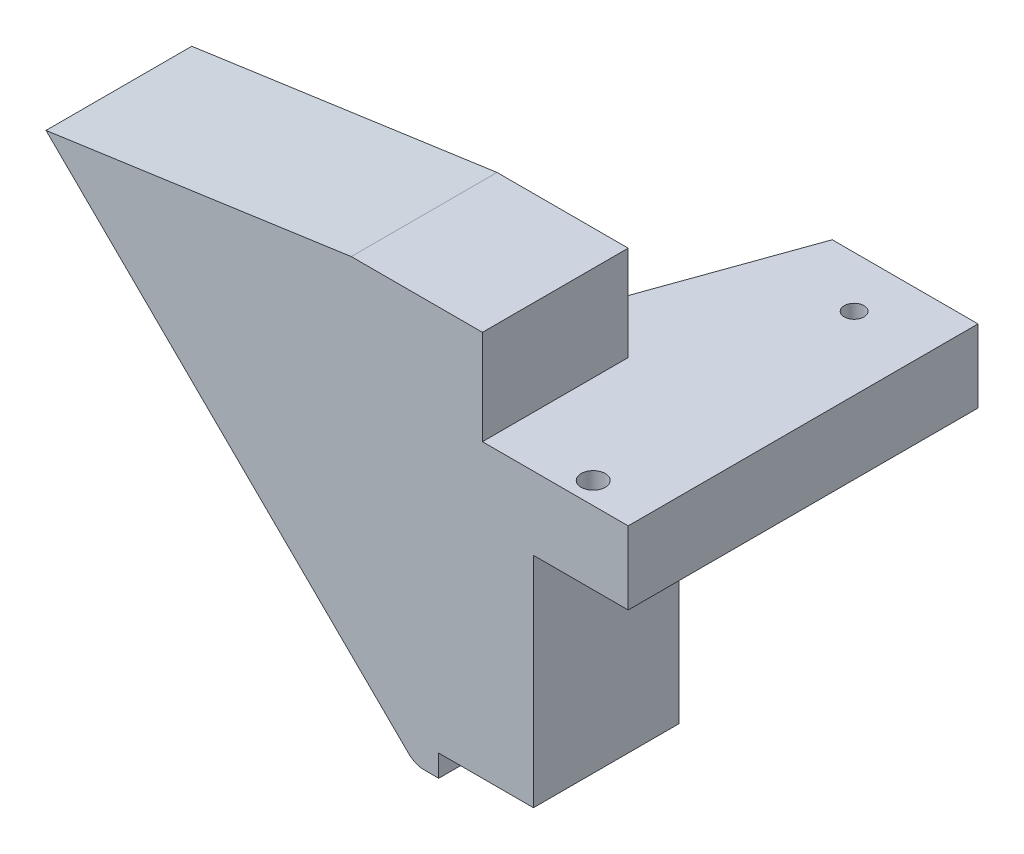
ISO-10303-21;
HEADER;
FILE_DESCRIPTION(('STEP AP214'),'2;1');
FILE_NAME('part.step','',(''),(''),'','','');
FILE_SCHEMA(('AUTOMOTIVE_DESIGN { 1 0 10303 214 1 1 1 1 }'));
ENDSEC;
DATA;
#1=APPLICATION_CONTEXT('core data for automotive mechanical design processes');
#2=APPLICATION_PROTOCOL_DEFINITION('international standard','automotive_design',2000,#1);
#3=PRODUCT_CONTEXT('',#1,'mechanical');
#4=PRODUCT('Part','Part','',(#3));
#5=PRODUCT_RELATED_PRODUCT_CATEGORY('part','',(#4));
#6=PRODUCT_DEFINITION_FORMATION('','',#4);
#7=PRODUCT_DEFINITION_CONTEXT('part definition',#1,'design');
#8=PRODUCT_DEFINITION('design','',#6,#7);
#9=PRODUCT_DEFINITION_SHAPE('','',#8);
#10=(LENGTH_UNIT() NAMED_UNIT(*) SI_UNIT(.MILLI.,.METRE.));
#11=(NAMED_UNIT(*) PLANE_ANGLE_UNIT() SI_UNIT($,.RADIAN.));
#12=(NAMED_UNIT(*) SI_UNIT($,.STERADIAN.) SOLID_ANGLE_UNIT());
#13=UNCERTAINTY_MEASURE_WITH_UNIT(LENGTH_MEASURE(1.E-05),#10,'distance_accuracy_value','');
#14=(GEOMETRIC_REPRESENTATION_CONTEXT(3) GLOBAL_UNCERTAINTY_ASSIGNED_CONTEXT((#13)) GLOBAL_UNIT_ASSIGNED_CONTEXT((#10,
#11,#12)) REPRESENTATION_CONTEXT('',''));
#15=CARTESIAN_POINT('',(0.,0.,0.));
#16=DIRECTION('',(0.,0.,1.));
#17=DIRECTION('',(1.,0.,0.));
#18=AXIS2_PLACEMENT_3D('',#15,#16,#17);
#19=CARTESIAN_POINT('',(-13.,0.,164.159554326699));
#20=DIRECTION('',(0.,0.,1.));
#21=DIRECTION('',(-1.,0.,0.));
#22=AXIS2_PLACEMENT_3D('',#19,#20,#21);
#23=PLANE('',#22);
#24=DIRECTION('',(1.,0.,0.));
#25=VECTOR('',#24,1.);
#26=CARTESIAN_POINT('',(-7.99999999999999,22.,164.159554326699));
#27=LINE('',#26,#25);
#28=CARTESIAN_POINT('',(-7.99999999999999,22.,164.159554326699));
#29=VERTEX_POINT('',#28);
#30=CARTESIAN_POINT('',(2.,22.,164.159554326699));
#31=VERTEX_POINT('',#30);
#32=EDGE_CURVE('E230',#29,#31,#27,.T.);
#33=ORIENTED_EDGE('',*,*,#32,.T.);
#34=DIRECTION('',(0.,-1.,0.));
#35=VECTOR('',#34,1.);
#36=CARTESIAN_POINT('',(2.,30.,164.159554326699));
#37=LINE('',#36,#35);
#38=CARTESIAN_POINT('',(2.,0.,164.159554326699));
#39=VERTEX_POINT('',#38);
#40=EDGE_CURVE('E285',#31,#39,#37,.T.);
#41=ORIENTED_EDGE('',*,*,#40,.T.);
#42=DIRECTION('',(-1.,0.,0.));
#43=VECTOR('',#42,1.);
#44=CARTESIAN_POINT('',(2.,0.,164.159554326699));
#45=LINE('',#44,#43);
#46=CARTESIAN_POINT('',(-11.,0.,164.159554326699));
#47=VERTEX_POINT('',#46);
#48=EDGE_CURVE('E288',#39,#47,#45,.T.);
#49=ORIENTED_EDGE('',*,*,#48,.T.);
#50=DIRECTION('',(0.,-1.,0.));
#51=VECTOR('',#50,1.);
#52=CARTESIAN_POINT('',(-11.,0.,164.159554326699));
#53=LINE('',#52,#51);
#54=CARTESIAN_POINT('',(-11.,-3.,164.159554326699));
#55=VERTEX_POINT('',#54);
#56=EDGE_CURVE('E291',#47,#55,#53,.T.);
#57=ORIENTED_EDGE('',*,*,#56,.T.);
#58=DIRECTION('',(-1.,0.,0.));
#59=VECTOR('',#58,1.);
#60=CARTESIAN_POINT('',(-11.,-3.,164.159554326699));
#61=LINE('',#60,#59);
#62=CARTESIAN_POINT('',(-13.,-3.,164.159554326699));
#63=VERTEX_POINT('',#62);
#64=EDGE_CURVE('E294',#55,#63,#61,.T.);
#65=ORIENTED_EDGE('',*,*,#64,.T.);
#66=CARTESIAN_POINT('',(-13.,0.,164.159554326699));
#67=DIRECTION('',(0.,0.,-1.));
#68=DIRECTION('',(-1.,0.,0.));
#69=AXIS2_PLACEMENT_3D('',#66,#67,#68);
#70=CIRCLE('',#69,3.);
#71=CARTESIAN_POINT('',(-15.1213203435597,-2.12132034355963,164.159554326699));
#72=VERTEX_POINT('',#71);
#73=EDGE_CURVE('E297',#63,#72,#70,.T.);
#74=ORIENTED_EDGE('',*,*,#73,.T.);
#75=DIRECTION('',(-0.711348006313715,0.702839963230252,0.));
#76=VECTOR('',#75,1.);
#77=CARTESIAN_POINT('',(-15.1213203435597,-2.12132034355963,164.159554326699));
#78=LINE('',#77,#76);
#79=CARTESIAN_POINT('',(-64.8885781508878,47.0506986076638,164.159554326699));
#80=VERTEX_POINT('',#79);
#81=EDGE_CURVE('E300',#72,#80,#78,.T.);
#82=ORIENTED_EDGE('',*,*,#81,.T.);
#83=DIRECTION('',(0.99006425657859,0.140615674252494,0.));
#84=VECTOR('',#83,1.);
#85=CARTESIAN_POINT('',(-64.8885781508878,47.0506986076638,164.159554326699));
#86=LINE('',#85,#84);
#87=CARTESIAN_POINT('',(-23.0000000000006,53.,164.159554326699));
#88=VERTEX_POINT('',#87);
#89=EDGE_CURVE('E303',#80,#88,#86,.T.);
#90=ORIENTED_EDGE('',*,*,#89,.T.);
#91=DIRECTION('',(1.,0.,0.));
#92=VECTOR('',#91,1.);
#93=CARTESIAN_POINT('',(-23.0000000000006,53.,164.159554326699));
#94=LINE('',#93,#92);
#95=CARTESIAN_POINT('',(-5.,53.,164.159554326699));
#96=VERTEX_POINT('',#95);
#97=EDGE_CURVE('E306',#88,#96,#94,.T.);
#98=ORIENTED_EDGE('',*,*,#97,.T.);
#99=DIRECTION('',(0.,-1.,0.));
#100=VECTOR('',#99,1.);
#101=CARTESIAN_POINT('',(-5.,53.,164.159554326699));
#102=LINE('',#101,#100);
#103=CARTESIAN_POINT('',(-5.,40.,164.159554326699));
#104=VERTEX_POINT('',#103);
#105=EDGE_CURVE('E220',#96,#104,#102,.T.);
#106=ORIENTED_EDGE('',*,*,#105,.T.);
#107=DIRECTION('',(-1.,0.,0.));
#108=VECTOR('',#107,1.);
#109=CARTESIAN_POINT('',(15.,40.,164.159554326699));
#110=LINE('',#109,#108);
#111=CARTESIAN_POINT('',(-15.,40.,164.159554326699));
#112=VERTEX_POINT('',#111);
#113=EDGE_CURVE('E200',#104,#112,#110,.T.);
#114=ORIENTED_EDGE('',*,*,#113,.T.);
#115=DIRECTION('',(0.,-1.,0.));
#116=VECTOR('',#115,1.);
#117=CARTESIAN_POINT('',(-15.,40.,164.159554326699));
#118=LINE('',#117,#116);
#119=CARTESIAN_POINT('',(-15.,43.,164.159554326699));
#120=VERTEX_POINT('',#119);
#121=EDGE_CURVE('E207',#120,#112,#118,.T.);
#122=ORIENTED_EDGE('',*,*,#121,.F.);
#123=DIRECTION('',(1.,0.,0.));
#124=VECTOR('',#123,1.);
#125=CARTESIAN_POINT('',(-5.,43.,164.159554326699));
#126=LINE('',#125,#124);
#127=CARTESIAN_POINT('',(-22.2934113871567,43.,164.159554326699));
#128=VERTEX_POINT('',#127);
#129=EDGE_CURVE('E265',#128,#120,#126,.T.);
#130=ORIENTED_EDGE('',*,*,#129,.F.);
#131=DIRECTION('',(0.99006425657859,0.140615674252493,0.));
#132=VECTOR('',#131,1.);
#133=CARTESIAN_POINT('',(-21.5938432574751,43.0993574342141,164.159554326699));
#134=LINE('',#133,#132);
#135=CARTESIAN_POINT('',(-43.5109209246919,39.9865446714646,164.159554326699));
#136=VERTEX_POINT('',#135);
#137=EDGE_CURVE('E268',#136,#128,#134,.T.);
#138=ORIENTED_EDGE('',*,*,#137,.F.);
#139=DIRECTION('',(-0.711348006313715,0.702839963230252,0.));
#140=VECTOR('',#139,1.);
#141=CARTESIAN_POINT('',(-8.09292071125713,4.99215971957752,164.159554326699));
#142=LINE('',#141,#140);
#143=CARTESIAN_POINT('',(-13.1613820762649,10.,164.159554326699));
#144=VERTEX_POINT('',#143);
#145=EDGE_CURVE('E271',#144,#136,#142,.T.);
#146=ORIENTED_EDGE('',*,*,#145,.F.);
#147=DIRECTION('',(-1.,0.,0.));
#148=VECTOR('',#147,1.);
#149=CARTESIAN_POINT('',(0.,10.,164.159554326699));
#150=LINE('',#149,#148);
#151=CARTESIAN_POINT('',(-8.,10.,164.159554326699));
#152=VERTEX_POINT('',#151);
#153=EDGE_CURVE('E274',#152,#144,#150,.T.);
#154=ORIENTED_EDGE('',*,*,#153,.F.);
#155=DIRECTION('',(0.,-1.,0.));
#156=VECTOR('',#155,1.);
#157=CARTESIAN_POINT('',(-8.,0.,164.159554326699));
#158=LINE('',#157,#156);
#159=EDGE_CURVE('E214',#29,#152,#158,.T.);
#160=ORIENTED_EDGE('',*,*,#159,.F.);
#161=EDGE_LOOP('',(#33,#41,#49,#57,#65,#74,#82,#90,#98,#106,#114,#122,#130,#138,#146,#154,#160));
#162=FACE_BOUND('',#161,.T.);
#163=ADVANCED_FACE('F33',(#162),#23,.F.);
#164=CARTESIAN_POINT('',(15.,0.,252.319108653397));
#165=DIRECTION('',(1.,0.,0.));
#166=DIRECTION('',(0.,0.,1.));
#167=AXIS2_PLACEMENT_3D('',#164,#165,#166);
#168=PLANE('',#167);
#169=DIRECTION('',(0.,0.,-1.));
#170=VECTOR('',#169,1.);
#171=CARTESIAN_POINT('',(15.,40.,231.319108653397));
#172=LINE('',#171,#170);
#173=CARTESIAN_POINT('',(15.,40.,184.159554326699));
#174=VERTEX_POINT('',#173);
#175=CARTESIAN_POINT('',(15.,40.,136.159554326699));
#176=VERTEX_POINT('',#175);
#177=EDGE_CURVE('E346',#174,#176,#172,.T.);
#178=ORIENTED_EDGE('',*,*,#177,.F.);
#179=DIRECTION('',(0.,1.,0.));
#180=VECTOR('',#179,1.);
#181=CARTESIAN_POINT('',(15.,0.,184.159554326699));
#182=LINE('',#181,#180);
#183=CARTESIAN_POINT('',(15.,30.,184.159554326699));
#184=VERTEX_POINT('',#183);
#185=EDGE_CURVE('E323',#184,#174,#182,.T.);
#186=ORIENTED_EDGE('',*,*,#185,.F.);
#187=DIRECTION('',(0.,0.,1.));
#188=VECTOR('',#187,1.);
#189=CARTESIAN_POINT('',(15.,30.,169.159554326699));
#190=LINE('',#189,#188);
#191=CARTESIAN_POINT('',(15.,30.,136.159554326699));
#192=VERTEX_POINT('',#191);
#193=EDGE_CURVE('E310',#192,#184,#190,.T.);
#194=ORIENTED_EDGE('',*,*,#193,.F.);
#195=DIRECTION('',(0.,1.,0.));
#196=VECTOR('',#195,1.);
#197=CARTESIAN_POINT('',(15.,30.,136.159554326699));
#198=LINE('',#197,#196);
#199=EDGE_CURVE('E232',#192,#176,#198,.T.);
#200=ORIENTED_EDGE('',*,*,#199,.T.);
#201=EDGE_LOOP('',(#178,#186,#194,#200));
#202=FACE_BOUND('',#201,.T.);
#203=ADVANCED_FACE('F399',(#202),#168,.T.);
#204=CARTESIAN_POINT('',(-11.,0.,80.3191086533971));
#205=DIRECTION('',(-1.,0.,0.));
#206=DIRECTION('',(0.,-1.,0.));
#207=AXIS2_PLACEMENT_3D('',#204,#205,#206);
#208=PLANE('',#207);
#209=DIRECTION('',(0.,-1.,0.));
#210=VECTOR('',#209,1.);
#211=CARTESIAN_POINT('',(-11.,0.,184.159554326699));
#212=LINE('',#211,#210);
#213=CARTESIAN_POINT('',(-11.,0.,184.159554326699));
#214=VERTEX_POINT('',#213);
#215=CARTESIAN_POINT('',(-11.,-3.,184.159554326699));
#216=VERTEX_POINT('',#215);
#217=EDGE_CURVE('E331',#214,#216,#212,.T.);
#218=ORIENTED_EDGE('',*,*,#217,.T.);
#219=DIRECTION('',(0.,0.,1.));
#220=VECTOR('',#219,1.);
#221=CARTESIAN_POINT('',(-11.,-3.,80.3191086533971));
#222=LINE('',#221,#220);
#223=EDGE_CURVE('E348',#55,#216,#222,.T.);
#224=ORIENTED_EDGE('',*,*,#223,.F.);
#225=ORIENTED_EDGE('',*,*,#56,.F.);
#226=DIRECTION('',(0.,0.,1.));
#227=VECTOR('',#226,1.);
#228=CARTESIAN_POINT('',(-11.,0.,80.3191086533971));
#229=LINE('',#228,#227);
#230=EDGE_CURVE('E349',#47,#214,#229,.T.);
#231=ORIENTED_EDGE('',*,*,#230,.T.);
#232=EDGE_LOOP('',(#218,#224,#225,#231));
#233=FACE_BOUND('',#232,.T.);
#234=ADVANCED_FACE('F449',(#233),#208,.F.);
#235=CARTESIAN_POINT('',(-5.,-3.,80.3191086533971));
#236=DIRECTION('',(0.,1.,0.));
#237=DIRECTION('',(-1.,0.,0.));
#238=AXIS2_PLACEMENT_3D('',#235,#236,#237);
#239=PLANE('',#238);
#240=DIRECTION('',(1.,0.,0.));
#241=VECTOR('',#240,1.);
#242=CARTESIAN_POINT('',(-82.5,-3.,184.159554326699));
#243=LINE('',#242,#241);
#244=CARTESIAN_POINT('',(-13.,-3.,184.159554326699));
#245=VERTEX_POINT('',#244);
#246=EDGE_CURVE('E319',#245,#216,#243,.T.);
#247=ORIENTED_EDGE('',*,*,#246,.F.);
#248=DIRECTION('',(0.,0.,1.));
#249=VECTOR('',#248,1.);
#250=CARTESIAN_POINT('',(-13.,-3.,80.3191086533971));
#251=LINE('',#250,#249);
#252=EDGE_CURVE('E352',#63,#245,#251,.T.);
#253=ORIENTED_EDGE('',*,*,#252,.F.);
#254=ORIENTED_EDGE('',*,*,#64,.F.);
#255=ORIENTED_EDGE('',*,*,#223,.T.);
#256=EDGE_LOOP('',(#247,#253,#254,#255));
#257=FACE_BOUND('',#256,.T.);
#258=ADVANCED_FACE('F460',(#257),#239,.F.);
#259=CARTESIAN_POINT('',(-13.,0.,80.3191086533971));
#260=DIRECTION('',(0.,0.,1.));
#261=DIRECTION('',(-1.,0.,0.));
#262=AXIS2_PLACEMENT_3D('',#259,#260,#261);
#263=CYLINDRICAL_SURFACE('',#262,3.);
#264=CARTESIAN_POINT('',(-13.,0.,184.159554326699));
#265=DIRECTION('',(0.,0.,-1.));
#266=DIRECTION('',(-1.,0.,0.));
#267=AXIS2_PLACEMENT_3D('',#264,#265,#266);
#268=CIRCLE('',#267,3.);
#269=CARTESIAN_POINT('',(-15.1213203435597,-2.12132034355963,184.159554326699));
#270=VERTEX_POINT('',#269);
#271=EDGE_CURVE('E337',#245,#270,#268,.T.);
#272=ORIENTED_EDGE('',*,*,#271,.T.);
#273=DIRECTION('',(0.,0.,1.));
#274=VECTOR('',#273,1.);
#275=CARTESIAN_POINT('',(-15.1213203435597,-2.12132034355963,80.3191086533971));
#276=LINE('',#275,#274);
#277=EDGE_CURVE('E357',#72,#270,#276,.T.);
#278=ORIENTED_EDGE('',*,*,#277,.F.);
#279=ORIENTED_EDGE('',*,*,#73,.F.);
#280=ORIENTED_EDGE('',*,*,#252,.T.);
#281=EDGE_LOOP('',(#272,#278,#279,#280));
#282=FACE_BOUND('',#281,.T.);
#283=ADVANCED_FACE('F464',(#282),#263,.T.);
#284=CARTESIAN_POINT('',(-15.1213203435597,-2.12132034355963,80.3191086533971));
#285=DIRECTION('',(0.702839963230252,0.711348006313715,0.));
#286=DIRECTION('',(-0.711348006313715,0.702839963230252,0.));
#287=AXIS2_PLACEMENT_3D('',#284,#285,#286);
#288=PLANE('',#287);
#289=DIRECTION('',(-0.711348006313715,0.702839963230252,0.));
#290=VECTOR('',#289,1.);
#291=CARTESIAN_POINT('',(-15.1213203435597,-2.12132034355963,184.159554326699));
#292=LINE('',#291,#290);
#293=CARTESIAN_POINT('',(-64.8885781508878,47.0506986076638,184.159554326699));
#294=VERTEX_POINT('',#293);
#295=EDGE_CURVE('E340',#270,#294,#292,.T.);
#296=ORIENTED_EDGE('',*,*,#295,.T.);
#297=DIRECTION('',(0.,0.,1.));
#298=VECTOR('',#297,1.);
#299=CARTESIAN_POINT('',(-64.8885781508878,47.0506986076638,80.3191086533971));
#300=LINE('',#299,#298);
#301=EDGE_CURVE('E360',#80,#294,#300,.T.);
#302=ORIENTED_EDGE('',*,*,#301,.F.);
#303=ORIENTED_EDGE('',*,*,#81,.F.);
#304=ORIENTED_EDGE('',*,*,#277,.T.);
#305=EDGE_LOOP('',(#296,#302,#303,#304));
#306=FACE_BOUND('',#305,.T.);
#307=ADVANCED_FACE('F468',(#306),#288,.F.);
#308=CARTESIAN_POINT('',(-23.,53.,80.3191086533971));
#309=DIRECTION('',(0.140615674252493,-0.99006425657859,0.));
#310=DIRECTION('',(0.99006425657859,0.140615674252493,0.));
#311=AXIS2_PLACEMENT_3D('',#308,#309,#310);
#312=PLANE('',#311);
#313=DIRECTION('',(0.99006425657859,0.140615674252493,0.));
#314=VECTOR('',#313,1.);
#315=CARTESIAN_POINT('',(-23.,53.,184.159554326699));
#316=LINE('',#315,#314);
#317=CARTESIAN_POINT('',(-23.0000000000006,53.,184.159554326699));
#318=VERTEX_POINT('',#317);
#319=EDGE_CURVE('E343',#294,#318,#316,.T.);
#320=ORIENTED_EDGE('',*,*,#319,.T.);
#321=DIRECTION('',(0.,0.,1.));
#322=VECTOR('',#321,1.);
#323=CARTESIAN_POINT('',(-23.,53.,80.3191086533971));
#324=LINE('',#323,#322);
#325=EDGE_CURVE('E363',#88,#318,#324,.T.);
#326=ORIENTED_EDGE('',*,*,#325,.F.);
#327=ORIENTED_EDGE('',*,*,#89,.F.);
#328=ORIENTED_EDGE('',*,*,#301,.T.);
#329=EDGE_LOOP('',(#320,#326,#327,#328));
#330=FACE_BOUND('',#329,.T.);
#331=ADVANCED_FACE('F472',(#330),#312,.F.);
#332=CARTESIAN_POINT('',(-5.,53.,80.3191086533971));
#333=DIRECTION('',(0.,-1.,0.));
#334=DIRECTION('',(0.,0.,1.));
#335=AXIS2_PLACEMENT_3D('',#332,#333,#334);
#336=PLANE('',#335);
#337=DIRECTION('',(1.,0.,0.));
#338=VECTOR('',#337,1.);
#339=CARTESIAN_POINT('',(-82.5,53.,184.159554326699));
#340=LINE('',#339,#338);
#341=CARTESIAN_POINT('',(-5.,53.,184.159554326699));
#342=VERTEX_POINT('',#341);
#343=EDGE_CURVE('E320',#318,#342,#340,.T.);
#344=ORIENTED_EDGE('',*,*,#343,.T.);
#345=DIRECTION('',(0.,0.,1.));
#346=VECTOR('',#345,1.);
#347=CARTESIAN_POINT('',(-5.,53.,80.3191086533971));
#348=LINE('',#347,#346);
#349=EDGE_CURVE('E225',#96,#342,#348,.T.);
#350=ORIENTED_EDGE('',*,*,#349,.F.);
#351=ORIENTED_EDGE('',*,*,#97,.F.);
#352=ORIENTED_EDGE('',*,*,#325,.T.);
#353=EDGE_LOOP('',(#344,#350,#351,#352));
#354=FACE_BOUND('',#353,.T.);
#355=ADVANCED_FACE('F476',(#354),#336,.F.);
#356=CARTESIAN_POINT('',(-5.,40.,80.3191086533971));
#357=DIRECTION('',(-1.,0.,0.));
#358=DIRECTION('',(0.,0.,-1.));
#359=AXIS2_PLACEMENT_3D('',#356,#357,#358);
#360=PLANE('',#359);
#361=DIRECTION('',(0.,-1.,0.));
#362=VECTOR('',#361,1.);
#363=CARTESIAN_POINT('',(-5.,40.,184.159554326699));
#364=LINE('',#363,#362);
#365=CARTESIAN_POINT('',(-5.,40.,184.159554326699));
#366=VERTEX_POINT('',#365);
#367=EDGE_CURVE('E334',#342,#366,#364,.T.);
#368=ORIENTED_EDGE('',*,*,#367,.T.);
#369=DIRECTION('',(0.,0.,1.));
#370=VECTOR('',#369,1.);
#371=CARTESIAN_POINT('',(-5.,40.,80.3191086533971));
#372=LINE('',#371,#370);
#373=EDGE_CURVE('E221',#104,#366,#372,.T.);
#374=ORIENTED_EDGE('',*,*,#373,.F.);
#375=ORIENTED_EDGE('',*,*,#105,.F.);
#376=ORIENTED_EDGE('',*,*,#349,.T.);
#377=EDGE_LOOP('',(#368,#374,#375,#376));
#378=FACE_BOUND('',#377,.T.);
#379=ADVANCED_FACE('F480',(#378),#360,.F.);
#380=CARTESIAN_POINT('',(0.,40.,80.3191086533971));
#381=DIRECTION('',(0.,-1.,0.));
#382=DIRECTION('',(0.,0.,1.));
#383=AXIS2_PLACEMENT_3D('',#380,#381,#382);
#384=PLANE('',#383);
#385=CARTESIAN_POINT('',(5.,40.,143.159554326699));
#386=DIRECTION('',(0.,-1.,0.));
#387=DIRECTION('',(0.,0.,-1.));
#388=AXIS2_PLACEMENT_3D('',#385,#386,#387);
#389=CIRCLE('',#388,1.35);
#390=CARTESIAN_POINT('',(5.,40.,141.809554326699));
#391=VERTEX_POINT('',#390);
#392=EDGE_CURVE('E376',#391,#391,#389,.T.);
#393=ORIENTED_EDGE('',*,*,#392,.T.);
#394=EDGE_LOOP('',(#393));
#395=FACE_BOUND('',#394,.T.);
#396=CARTESIAN_POINT('',(7.2,40.,181.159554326699));
#397=DIRECTION('',(0.,-1.,0.));
#398=DIRECTION('',(0.,0.,-1.));
#399=AXIS2_PLACEMENT_3D('',#396,#397,#398);
#400=CIRCLE('',#399,1.65);
#401=CARTESIAN_POINT('',(7.2,40.,179.509554326699));
#402=VERTEX_POINT('',#401);
#403=EDGE_CURVE('E368',#402,#402,#400,.T.);
#404=ORIENTED_EDGE('',*,*,#403,.T.);
#405=EDGE_LOOP('',(#404));
#406=FACE_BOUND('',#405,.T.);
#407=ORIENTED_EDGE('',*,*,#113,.F.);
#408=ORIENTED_EDGE('',*,*,#373,.T.);
#409=DIRECTION('',(1.,0.,0.));
#410=VECTOR('',#409,1.);
#411=CARTESIAN_POINT('',(0.,40.,184.159554326699));
#412=LINE('',#411,#410);
#413=EDGE_CURVE('E327',#366,#174,#412,.T.);
#414=ORIENTED_EDGE('',*,*,#413,.T.);
#415=ORIENTED_EDGE('',*,*,#177,.T.);
#416=DIRECTION('',(-1.,0.,0.));
#417=VECTOR('',#416,1.);
#418=CARTESIAN_POINT('',(15.,40.,136.159554326699));
#419=LINE('',#418,#417);
#420=CARTESIAN_POINT('',(-5.,40.,136.159554326699));
#421=VERTEX_POINT('',#420);
#422=EDGE_CURVE('E203',#176,#421,#419,.T.);
#423=ORIENTED_EDGE('',*,*,#422,.T.);
#424=DIRECTION('',(-0.336336396998156,0.,0.941741911594837));
#425=VECTOR('',#424,1.);
#426=CARTESIAN_POINT('',(-5.,40.,136.159554326699));
#427=LINE('',#426,#425);
#428=EDGE_CURVE('E185',#421,#112,#427,.T.);
#429=ORIENTED_EDGE('',*,*,#428,.T.);
#430=EDGE_LOOP('',(#407,#408,#414,#415,#423,#429));
#431=FACE_BOUND('',#430,.T.);
#432=ADVANCED_FACE('F197',(#395,#406,#431),#384,.F.);
#433=CARTESIAN_POINT('',(0.,0.,80.3191086533971));
#434=DIRECTION('',(0.,1.,0.));
#435=DIRECTION('',(-1.,0.,0.));
#436=AXIS2_PLACEMENT_3D('',#433,#434,#435);
#437=PLANE('',#436);
#438=CARTESIAN_POINT('',(-5.,0.,174.159554326699));
#439=DIRECTION('',(0.,1.,0.));
#440=DIRECTION('',(1.,0.,0.));
#441=AXIS2_PLACEMENT_3D('',#438,#439,#440);
#442=CIRCLE('',#441,1.35);
#443=CARTESIAN_POINT('',(-3.65,0.,174.159554326699));
#444=VERTEX_POINT('',#443);
#445=EDGE_CURVE('E495',#444,#444,#442,.T.);
#446=ORIENTED_EDGE('',*,*,#445,.T.);
#447=EDGE_LOOP('',(#446));
#448=FACE_BOUND('',#447,.T.);
#449=DIRECTION('',(-1.,0.,0.));
#450=VECTOR('',#449,1.);
#451=CARTESIAN_POINT('',(0.,0.,184.159554326699));
#452=LINE('',#451,#450);
#453=CARTESIAN_POINT('',(2.,0.,184.159554326699));
#454=VERTEX_POINT('',#453);
#455=EDGE_CURVE('E329',#454,#214,#452,.T.);
#456=ORIENTED_EDGE('',*,*,#455,.T.);
#457=ORIENTED_EDGE('',*,*,#230,.F.);
#458=ORIENTED_EDGE('',*,*,#48,.F.);
#459=DIRECTION('',(0.,0.,1.));
#460=VECTOR('',#459,1.);
#461=CARTESIAN_POINT('',(2.,0.,169.159554326699));
#462=LINE('',#461,#460);
#463=EDGE_CURVE('E316',#39,#454,#462,.T.);
#464=ORIENTED_EDGE('',*,*,#463,.T.);
#465=EDGE_LOOP('',(#456,#457,#458,#464));
#466=FACE_BOUND('',#465,.T.);
#467=ADVANCED_FACE('F35',(#448,#466),#437,.F.);
#468=CARTESIAN_POINT('',(-82.5,-3.,184.159554326699));
#469=DIRECTION('',(0.,0.,1.));
#470=DIRECTION('',(-1.,0.,0.));
#471=AXIS2_PLACEMENT_3D('',#468,#469,#470);
#472=PLANE('',#471);
#473=ORIENTED_EDGE('',*,*,#185,.T.);
#474=ORIENTED_EDGE('',*,*,#413,.F.);
#475=ORIENTED_EDGE('',*,*,#367,.F.);
#476=ORIENTED_EDGE('',*,*,#343,.F.);
#477=ORIENTED_EDGE('',*,*,#319,.F.);
#478=ORIENTED_EDGE('',*,*,#295,.F.);
#479=ORIENTED_EDGE('',*,*,#271,.F.);
#480=ORIENTED_EDGE('',*,*,#246,.T.);
#481=ORIENTED_EDGE('',*,*,#217,.F.);
#482=ORIENTED_EDGE('',*,*,#455,.F.);
#483=DIRECTION('',(0.,-1.,0.));
#484=VECTOR('',#483,1.);
#485=CARTESIAN_POINT('',(2.,0.,184.159554326699));
#486=LINE('',#485,#484);
#487=CARTESIAN_POINT('',(2.,30.,184.159554326699));
#488=VERTEX_POINT('',#487);
#489=EDGE_CURVE('E312',#488,#454,#486,.T.);
#490=ORIENTED_EDGE('',*,*,#489,.F.);
#491=DIRECTION('',(-1.,0.,0.));
#492=VECTOR('',#491,1.);
#493=CARTESIAN_POINT('',(15.,30.,184.159554326699));
#494=LINE('',#493,#492);
#495=EDGE_CURVE('E308',#184,#488,#494,.T.);
#496=ORIENTED_EDGE('',*,*,#495,.F.);
#497=EDGE_LOOP('',(#473,#474,#475,#476,#477,#478,#479,#480,#481,#482,#490,#496));
#498=FACE_BOUND('',#497,.T.);
#499=ADVANCED_FACE('F401',(#498),#472,.T.);
#500=CARTESIAN_POINT('',(2.,0.,169.159554326699));
#501=DIRECTION('',(1.,0.,0.));
#502=DIRECTION('',(0.,0.,1.));
#503=AXIS2_PLACEMENT_3D('',#500,#501,#502);
#504=PLANE('',#503);
#505=DIRECTION('',(0.,0.274721127897378,-0.961523947640823));
#506=VECTOR('',#505,1.);
#507=CARTESIAN_POINT('',(2.,30.,136.159554326699));
#508=LINE('',#507,#506);
#509=CARTESIAN_POINT('',(2.,30.,136.159554326699));
#510=VERTEX_POINT('',#509);
#511=EDGE_CURVE('E384',#31,#510,#508,.T.);
#512=ORIENTED_EDGE('',*,*,#511,.T.);
#513=DIRECTION('',(0.,0.,1.));
#514=VECTOR('',#513,1.);
#515=CARTESIAN_POINT('',(2.,30.,169.159554326699));
#516=LINE('',#515,#514);
#517=EDGE_CURVE('E56',#510,#488,#516,.T.);
#518=ORIENTED_EDGE('',*,*,#517,.T.);
#519=ORIENTED_EDGE('',*,*,#489,.T.);
#520=ORIENTED_EDGE('',*,*,#463,.F.);
#521=ORIENTED_EDGE('',*,*,#40,.F.);
#522=EDGE_LOOP('',(#512,#518,#519,#520,#521));
#523=FACE_BOUND('',#522,.T.);
#524=ADVANCED_FACE('F405',(#523),#504,.T.);
#525=CARTESIAN_POINT('',(15.,30.,169.159554326699));
#526=DIRECTION('',(0.,-1.,0.));
#527=DIRECTION('',(0.,0.,1.));
#528=AXIS2_PLACEMENT_3D('',#525,#526,#527);
#529=PLANE('',#528);
#530=CARTESIAN_POINT('',(5.,30.,143.159554326699));
#531=DIRECTION('',(0.,1.,0.));
#532=DIRECTION('',(0.,0.,1.));
#533=AXIS2_PLACEMENT_3D('',#530,#531,#532);
#534=CIRCLE('',#533,1.35);
#535=CARTESIAN_POINT('',(5.,30.,144.509554326699));
#536=VERTEX_POINT('',#535);
#537=EDGE_CURVE('E37',#536,#536,#534,.T.);
#538=ORIENTED_EDGE('',*,*,#537,.T.);
#539=EDGE_LOOP('',(#538));
#540=FACE_BOUND('',#539,.T.);
#541=CARTESIAN_POINT('',(7.2,30.,181.159554326699));
#542=DIRECTION('',(0.,1.,0.));
#543=DIRECTION('',(0.,0.,1.));
#544=AXIS2_PLACEMENT_3D('',#541,#542,#543);
#545=CIRCLE('',#544,1.65);
#546=CARTESIAN_POINT('',(7.2,30.,182.809554326699));
#547=VERTEX_POINT('',#546);
#548=EDGE_CURVE('E204',#547,#547,#545,.T.);
#549=ORIENTED_EDGE('',*,*,#548,.T.);
#550=EDGE_LOOP('',(#549));
#551=FACE_BOUND('',#550,.T.);
#552=ORIENTED_EDGE('',*,*,#495,.T.);
#553=ORIENTED_EDGE('',*,*,#517,.F.);
#554=DIRECTION('',(1.,0.,0.));
#555=VECTOR('',#554,1.);
#556=CARTESIAN_POINT('',(2.,30.,136.159554326699));
#557=LINE('',#556,#555);
#558=EDGE_CURVE('E215',#510,#192,#557,.T.);
#559=ORIENTED_EDGE('',*,*,#558,.T.);
#560=ORIENTED_EDGE('',*,*,#193,.T.);
#561=EDGE_LOOP('',(#552,#553,#559,#560));
#562=FACE_BOUND('',#561,.T.);
#563=ADVANCED_FACE('F392',(#540,#551,#562),#529,.T.);
#564=CARTESIAN_POINT('',(-8.09292071125713,4.99215971957752,80.3191086533971));
#565=DIRECTION('',(0.702839963230252,0.711348006313715,0.));
#566=DIRECTION('',(-0.711348006313715,0.702839963230252,0.));
#567=AXIS2_PLACEMENT_3D('',#564,#565,#566);
#568=PLANE('',#567);
#569=DIRECTION('',(0.,0.,1.));
#570=VECTOR('',#569,1.);
#571=CARTESIAN_POINT('',(-13.1613820762649,10.,80.3191086533971));
#572=LINE('',#571,#570);
#573=CARTESIAN_POINT('',(-13.1613820762649,10.,174.159554326699));
#574=VERTEX_POINT('',#573);
#575=EDGE_CURVE('E241',#144,#574,#572,.T.);
#576=ORIENTED_EDGE('',*,*,#575,.F.);
#577=ORIENTED_EDGE('',*,*,#145,.T.);
#578=DIRECTION('',(0.,0.,1.));
#579=VECTOR('',#578,1.);
#580=CARTESIAN_POINT('',(-43.5109209246919,39.9865446714646,80.3191086533971));
#581=LINE('',#580,#579);
#582=CARTESIAN_POINT('',(-43.5109209246919,39.9865446714646,174.159554326699));
#583=VERTEX_POINT('',#582);
#584=EDGE_CURVE('E253',#136,#583,#581,.T.);
#585=ORIENTED_EDGE('',*,*,#584,.T.);
#586=DIRECTION('',(-0.711348006313715,0.702839963230252,0.));
#587=VECTOR('',#586,1.);
#588=CARTESIAN_POINT('',(-8.09292071125713,4.99215971957752,174.159554326699));
#589=LINE('',#588,#587);
#590=EDGE_CURVE('E245',#574,#583,#589,.T.);
#591=ORIENTED_EDGE('',*,*,#590,.F.);
#592=EDGE_LOOP('',(#576,#577,#585,#591));
#593=FACE_BOUND('',#592,.T.);
#594=ADVANCED_FACE('F433',(#593),#568,.T.);
#595=CARTESIAN_POINT('',(-21.5938432574751,43.0993574342141,80.3191086533971));
#596=DIRECTION('',(0.140615674252493,-0.99006425657859,0.));
#597=DIRECTION('',(0.99006425657859,0.140615674252493,0.));
#598=AXIS2_PLACEMENT_3D('',#595,#596,#597);
#599=PLANE('',#598);
#600=DIRECTION('',(0.99006425657859,0.140615674252493,0.));
#601=VECTOR('',#600,1.);
#602=CARTESIAN_POINT('',(-21.5938432574751,43.0993574342141,174.159554326699));
#603=LINE('',#602,#601);
#604=CARTESIAN_POINT('',(-22.2934113871567,43.,174.159554326699));
#605=VERTEX_POINT('',#604);
#606=EDGE_CURVE('E254',#583,#605,#603,.T.);
#607=ORIENTED_EDGE('',*,*,#606,.F.);
#608=ORIENTED_EDGE('',*,*,#584,.F.);
#609=ORIENTED_EDGE('',*,*,#137,.T.);
#610=DIRECTION('',(0.,0.,1.));
#611=VECTOR('',#610,1.);
#612=CARTESIAN_POINT('',(-22.2934113871567,43.,80.3191086533971));
#613=LINE('',#612,#611);
#614=EDGE_CURVE('E247',#128,#605,#613,.T.);
#615=ORIENTED_EDGE('',*,*,#614,.T.);
#616=EDGE_LOOP('',(#607,#608,#609,#615));
#617=FACE_BOUND('',#616,.T.);
#618=ADVANCED_FACE('F431',(#617),#599,.T.);
#619=CARTESIAN_POINT('',(-5.,43.,80.3191086533971));
#620=DIRECTION('',(0.,-1.,0.));
#621=DIRECTION('',(0.,0.,1.));
#622=AXIS2_PLACEMENT_3D('',#619,#620,#621);
#623=PLANE('',#622);
#624=DIRECTION('',(1.,0.,0.));
#625=VECTOR('',#624,1.);
#626=CARTESIAN_POINT('',(-5.,43.,174.159554326699));
#627=LINE('',#626,#625);
#628=CARTESIAN_POINT('',(-15.,43.,174.159554326699));
#629=VERTEX_POINT('',#628);
#630=EDGE_CURVE('E238',#605,#629,#627,.T.);
#631=ORIENTED_EDGE('',*,*,#630,.F.);
#632=ORIENTED_EDGE('',*,*,#614,.F.);
#633=ORIENTED_EDGE('',*,*,#129,.T.);
#634=DIRECTION('',(0.,0.,1.));
#635=VECTOR('',#634,1.);
#636=CARTESIAN_POINT('',(-15.,43.,80.3191086533971));
#637=LINE('',#636,#635);
#638=EDGE_CURVE('E210',#120,#629,#637,.T.);
#639=ORIENTED_EDGE('',*,*,#638,.T.);
#640=EDGE_LOOP('',(#631,#632,#633,#639));
#641=FACE_BOUND('',#640,.T.);
#642=ADVANCED_FACE('F428',(#641),#623,.T.);
#643=CARTESIAN_POINT('',(-15.,40.,80.3191086533971));
#644=DIRECTION('',(-1.,0.,0.));
#645=DIRECTION('',(0.,0.,-1.));
#646=AXIS2_PLACEMENT_3D('',#643,#644,#645);
#647=PLANE('',#646);
#648=DIRECTION('',(0.,1.,0.));
#649=VECTOR('',#648,1.);
#650=CARTESIAN_POINT('',(-15.,20.,164.159554326699));
#651=LINE('',#650,#649);
#652=CARTESIAN_POINT('',(-15.,30.,164.159554326699));
#653=VERTEX_POINT('',#652);
#654=EDGE_CURVE('E182',#653,#112,#651,.T.);
#655=ORIENTED_EDGE('',*,*,#654,.F.);
#656=DIRECTION('',(0.,0.,1.));
#657=VECTOR('',#656,1.);
#658=CARTESIAN_POINT('',(-15.,30.,80.3191086533971));
#659=LINE('',#658,#657);
#660=CARTESIAN_POINT('',(-15.,30.,174.159554326699));
#661=VERTEX_POINT('',#660);
#662=EDGE_CURVE('E239',#653,#661,#659,.T.);
#663=ORIENTED_EDGE('',*,*,#662,.T.);
#664=DIRECTION('',(0.,-1.,0.));
#665=VECTOR('',#664,1.);
#666=CARTESIAN_POINT('',(-15.,40.,174.159554326699));
#667=LINE('',#666,#665);
#668=EDGE_CURVE('E242',#629,#661,#667,.T.);
#669=ORIENTED_EDGE('',*,*,#668,.F.);
#670=ORIENTED_EDGE('',*,*,#638,.F.);
#671=ORIENTED_EDGE('',*,*,#121,.T.);
#672=EDGE_LOOP('',(#655,#663,#669,#670,#671));
#673=FACE_BOUND('',#672,.T.);
#674=ADVANCED_FACE('F208',(#673),#647,.T.);
#675=CARTESIAN_POINT('',(0.,30.,80.3191086533971));
#676=DIRECTION('',(0.,-1.,0.));
#677=DIRECTION('',(0.,0.,1.));
#678=AXIS2_PLACEMENT_3D('',#675,#676,#677);
#679=PLANE('',#678);
#680=DIRECTION('',(0.336336396998156,0.,-0.941741911594837));
#681=VECTOR('',#680,1.);
#682=CARTESIAN_POINT('',(13.252629851272,30.,85.0521907431371));
#683=LINE('',#682,#681);
#684=CARTESIAN_POINT('',(-8.,30.,144.559554326699));
#685=VERTEX_POINT('',#684);
#686=EDGE_CURVE('E188',#653,#685,#683,.T.);
#687=ORIENTED_EDGE('',*,*,#686,.T.);
#688=DIRECTION('',(0.,0.,-1.));
#689=VECTOR('',#688,1.);
#690=CARTESIAN_POINT('',(-8.,30.,80.3191086533971));
#691=LINE('',#690,#689);
#692=CARTESIAN_POINT('',(-8.,30.,174.159554326699));
#693=VERTEX_POINT('',#692);
#694=EDGE_CURVE('E281',#693,#685,#691,.T.);
#695=ORIENTED_EDGE('',*,*,#694,.F.);
#696=DIRECTION('',(1.,0.,0.));
#697=VECTOR('',#696,1.);
#698=CARTESIAN_POINT('',(0.,30.,174.159554326699));
#699=LINE('',#698,#697);
#700=EDGE_CURVE('E234',#661,#693,#699,.T.);
#701=ORIENTED_EDGE('',*,*,#700,.F.);
#702=ORIENTED_EDGE('',*,*,#662,.F.);
#703=EDGE_LOOP('',(#687,#695,#701,#702));
#704=FACE_BOUND('',#703,.T.);
#705=ADVANCED_FACE('F426',(#704),#679,.T.);
#706=CARTESIAN_POINT('',(0.,10.,80.3191086533971));
#707=DIRECTION('',(0.,1.,0.));
#708=DIRECTION('',(-1.,0.,0.));
#709=AXIS2_PLACEMENT_3D('',#706,#707,#708);
#710=PLANE('',#709);
#711=ORIENTED_EDGE('',*,*,#153,.T.);
#712=ORIENTED_EDGE('',*,*,#575,.T.);
#713=DIRECTION('',(-1.,0.,0.));
#714=VECTOR('',#713,1.);
#715=CARTESIAN_POINT('',(0.,10.,174.159554326699));
#716=LINE('',#715,#714);
#717=CARTESIAN_POINT('',(-8.,10.,174.159554326699));
#718=VERTEX_POINT('',#717);
#719=EDGE_CURVE('E237',#718,#574,#716,.T.);
#720=ORIENTED_EDGE('',*,*,#719,.F.);
#721=DIRECTION('',(0.,0.,1.));
#722=VECTOR('',#721,1.);
#723=CARTESIAN_POINT('',(-8.,10.,80.3191086533971));
#724=LINE('',#723,#722);
#725=EDGE_CURVE('E250',#152,#718,#724,.T.);
#726=ORIENTED_EDGE('',*,*,#725,.F.);
#727=EDGE_LOOP('',(#711,#712,#720,#726));
#728=FACE_BOUND('',#727,.T.);
#729=ADVANCED_FACE('F420',(#728),#710,.T.);
#730=CARTESIAN_POINT('',(-82.5,-3.,174.159554326699));
#731=DIRECTION('',(0.,0.,1.));
#732=DIRECTION('',(-1.,0.,0.));
#733=AXIS2_PLACEMENT_3D('',#730,#731,#732);
#734=PLANE('',#733);
#735=ORIENTED_EDGE('',*,*,#700,.T.);
#736=DIRECTION('',(0.,-1.,0.));
#737=VECTOR('',#736,1.);
#738=CARTESIAN_POINT('',(-7.99999999999999,-3.,174.159554326699));
#739=LINE('',#738,#737);
#740=EDGE_CURVE('E264',#693,#718,#739,.T.);
#741=ORIENTED_EDGE('',*,*,#740,.T.);
#742=ORIENTED_EDGE('',*,*,#719,.T.);
#743=ORIENTED_EDGE('',*,*,#590,.T.);
#744=ORIENTED_EDGE('',*,*,#606,.T.);
#745=ORIENTED_EDGE('',*,*,#630,.T.);
#746=ORIENTED_EDGE('',*,*,#668,.T.);
#747=EDGE_LOOP('',(#735,#741,#742,#743,#744,#745,#746));
#748=FACE_BOUND('',#747,.T.);
#749=ADVANCED_FACE('F424',(#748),#734,.F.);
#750=CARTESIAN_POINT('',(-8.,0.,169.159554326699));
#751=DIRECTION('',(1.,0.,0.));
#752=DIRECTION('',(0.,0.,1.));
#753=AXIS2_PLACEMENT_3D('',#750,#751,#752);
#754=PLANE('',#753);
#755=DIRECTION('',(0.,0.274721127897378,-0.961523947640823));
#756=VECTOR('',#755,1.);
#757=CARTESIAN_POINT('',(-8.,19.0188679245283,174.593516590849));
#758=LINE('',#757,#756);
#759=CARTESIAN_POINT('',(-8.00000000000002,27.6,144.559554326699));
#760=VERTEX_POINT('',#759);
#761=EDGE_CURVE('E233',#29,#760,#758,.T.);
#762=ORIENTED_EDGE('',*,*,#761,.F.);
#763=ORIENTED_EDGE('',*,*,#159,.T.);
#764=ORIENTED_EDGE('',*,*,#725,.T.);
#765=ORIENTED_EDGE('',*,*,#740,.F.);
#766=ORIENTED_EDGE('',*,*,#694,.T.);
#767=DIRECTION('',(0.,1.,0.));
#768=VECTOR('',#767,1.);
#769=CARTESIAN_POINT('',(-8.,0.,144.559554326699));
#770=LINE('',#769,#768);
#771=EDGE_CURVE('E380',#760,#685,#770,.T.);
#772=ORIENTED_EDGE('',*,*,#771,.F.);
#773=EDGE_LOOP('',(#762,#763,#764,#765,#766,#772));
#774=FACE_BOUND('',#773,.T.);
#775=ADVANCED_FACE('F415',(#774),#754,.F.);
#776=CARTESIAN_POINT('',(0.,0.,136.159554326699));
#777=DIRECTION('',(0.,0.,-1.));
#778=DIRECTION('',(1.,0.,0.));
#779=AXIS2_PLACEMENT_3D('',#776,#777,#778);
#780=PLANE('',#779);
#781=DIRECTION('',(0.,1.,0.));
#782=VECTOR('',#781,1.);
#783=CARTESIAN_POINT('',(-5.,20.,136.159554326699));
#784=LINE('',#783,#782);
#785=CARTESIAN_POINT('',(-5.,30.,136.159554326699));
#786=VERTEX_POINT('',#785);
#787=EDGE_CURVE('E193',#786,#421,#784,.T.);
#788=ORIENTED_EDGE('',*,*,#787,.T.);
#789=ORIENTED_EDGE('',*,*,#422,.F.);
#790=ORIENTED_EDGE('',*,*,#199,.F.);
#791=ORIENTED_EDGE('',*,*,#558,.F.);
#792=DIRECTION('',(-1.,0.,0.));
#793=VECTOR('',#792,1.);
#794=CARTESIAN_POINT('',(0.,30.,136.159554326699));
#795=LINE('',#794,#793);
#796=EDGE_CURVE('E42',#510,#786,#795,.T.);
#797=ORIENTED_EDGE('',*,*,#796,.T.);
#798=EDGE_LOOP('',(#788,#789,#790,#791,#797));
#799=FACE_BOUND('',#798,.T.);
#800=ADVANCED_FACE('F396',(#799),#780,.T.);
#801=CARTESIAN_POINT('',(-18.,30.,136.159554326699));
#802=DIRECTION('',(0.,0.961523947640823,0.274721127897378));
#803=DIRECTION('',(0.,0.274721127897378,-0.961523947640823));
#804=AXIS2_PLACEMENT_3D('',#801,#802,#803);
#805=PLANE('',#804);
#806=ORIENTED_EDGE('',*,*,#796,.F.);
#807=ORIENTED_EDGE('',*,*,#511,.F.);
#808=ORIENTED_EDGE('',*,*,#32,.F.);
#809=ORIENTED_EDGE('',*,*,#761,.T.);
#810=DIRECTION('',(-0.324784901230816,-0.259827920984652,0.909397723446283));
#811=VECTOR('',#810,1.);
#812=CARTESIAN_POINT('',(-6.37130801687764,28.9029535864979,139.999216773956));
#813=LINE('',#812,#811);
#814=EDGE_CURVE('E12',#786,#760,#813,.T.);
#815=ORIENTED_EDGE('',*,*,#814,.F.);
#816=EDGE_LOOP('',(#806,#807,#808,#809,#815));
#817=FACE_BOUND('',#816,.T.);
#818=ADVANCED_FACE('F413',(#817),#805,.F.);
#819=CARTESIAN_POINT('',(-5.,20.,136.159554326699));
#820=DIRECTION('',(0.941741911594837,0.,0.336336396998156));
#821=DIRECTION('',(-0.336336396998156,0.,0.941741911594837));
#822=AXIS2_PLACEMENT_3D('',#819,#820,#821);
#823=PLANE('',#822);
#824=ORIENTED_EDGE('',*,*,#686,.F.);
#825=ORIENTED_EDGE('',*,*,#654,.T.);
#826=ORIENTED_EDGE('',*,*,#428,.F.);
#827=ORIENTED_EDGE('',*,*,#787,.F.);
#828=ORIENTED_EDGE('',*,*,#814,.T.);
#829=ORIENTED_EDGE('',*,*,#771,.T.);
#830=EDGE_LOOP('',(#824,#825,#826,#827,#828,#829));
#831=FACE_BOUND('',#830,.T.);
#832=ADVANCED_FACE('F184',(#831),#823,.F.);
#833=CARTESIAN_POINT('',(7.2,18.,181.159554326699));
#834=DIRECTION('',(0.,1.,0.));
#835=DIRECTION('',(0.,0.,-1.));
#836=AXIS2_PLACEMENT_3D('',#833,#834,#835);
#837=CYLINDRICAL_SURFACE('',#836,1.65);
#838=ORIENTED_EDGE('',*,*,#548,.F.);
#839=EDGE_LOOP('',(#838));
#840=FACE_BOUND('',#839,.T.);
#841=ORIENTED_EDGE('',*,*,#403,.F.);
#842=EDGE_LOOP('',(#841));
#843=FACE_BOUND('',#842,.T.);
#844=ADVANCED_FACE('F513',(#840,#843),#837,.F.);
#845=CARTESIAN_POINT('',(5.,18.,143.159554326699));
#846=DIRECTION('',(0.,1.,0.));
#847=DIRECTION('',(0.,0.,-1.));
#848=AXIS2_PLACEMENT_3D('',#845,#846,#847);
#849=CYLINDRICAL_SURFACE('',#848,1.35);
#850=ORIENTED_EDGE('',*,*,#537,.F.);
#851=EDGE_LOOP('',(#850));
#852=FACE_BOUND('',#851,.T.);
#853=ORIENTED_EDGE('',*,*,#392,.F.);
#854=EDGE_LOOP('',(#853));
#855=FACE_BOUND('',#854,.T.);
#856=ADVANCED_FACE('F505',(#852,#855),#849,.F.);
#857=CARTESIAN_POINT('',(-5.,10.,174.159554326699));
#858=DIRECTION('',(0.,-1.,0.));
#859=DIRECTION('',(1.,0.,0.));
#860=AXIS2_PLACEMENT_3D('',#857,#858,#859);
#861=CYLINDRICAL_SURFACE('',#860,1.35);
#862=CARTESIAN_POINT('',(-5.,10.,174.159554326699));
#863=DIRECTION('',(0.,1.,0.));
#864=DIRECTION('',(1.,0.,0.));
#865=AXIS2_PLACEMENT_3D('',#862,#863,#864);
#866=CIRCLE('',#865,1.35);
#867=CARTESIAN_POINT('',(-3.65,10.,174.159554326699));
#868=VERTEX_POINT('',#867);
#869=EDGE_CURVE('E493',#868,#868,#866,.T.);
#870=ORIENTED_EDGE('',*,*,#869,.T.);
#871=EDGE_LOOP('',(#870));
#872=FACE_BOUND('',#871,.T.);
#873=ORIENTED_EDGE('',*,*,#445,.F.);
#874=EDGE_LOOP('',(#873));
#875=FACE_BOUND('',#874,.T.);
#876=ADVANCED_FACE('F502',(#872,#875),#861,.F.);
#877=CARTESIAN_POINT('',(-5.,10.,174.159554326699));
#878=DIRECTION('',(0.,-1.,0.));
#879=DIRECTION('',(1.,0.,0.));
#880=AXIS2_PLACEMENT_3D('',#877,#878,#879);
#881=PLANE('',#880);
#882=ORIENTED_EDGE('',*,*,#869,.F.);
#883=EDGE_LOOP('',(#882));
#884=FACE_BOUND('',#883,.T.);
#885=ADVANCED_FACE('F504',(#884),#881,.T.);
#886=CLOSED_SHELL('',(#163,#203,#234,#258,#283,#307,#331,#355,#379,#432,#467,#499,#524,#563,
#594,#618,#642,#674,#705,#729,#749,#775,#800,#818,#832,#844,#856,#876,#885));
#887=MANIFOLD_SOLID_BREP('B2',#886);
#888=ADVANCED_BREP_SHAPE_REPRESENTATION('',(#18,#887),#14);
#889=SHAPE_DEFINITION_REPRESENTATION(#9,#888);
ENDSEC;
END-ISO-10303-21;
